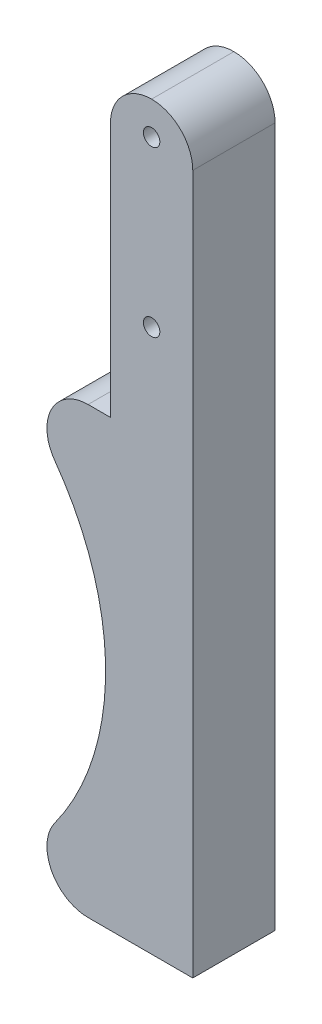
ISO-10303-21;
HEADER;
FILE_DESCRIPTION(('STEP AP214'),'2;1');
FILE_NAME('part.step','',(''),(''),'','','');
FILE_SCHEMA(('AUTOMOTIVE_DESIGN { 1 0 10303 214 1 1 1 1 }'));
ENDSEC;
DATA;
#1=APPLICATION_CONTEXT('core data for automotive mechanical design processes');
#2=APPLICATION_PROTOCOL_DEFINITION('international standard','automotive_design',2000,#1);
#3=PRODUCT_CONTEXT('',#1,'mechanical');
#4=PRODUCT('Part','Part','',(#3));
#5=PRODUCT_RELATED_PRODUCT_CATEGORY('part','',(#4));
#6=PRODUCT_DEFINITION_FORMATION('','',#4);
#7=PRODUCT_DEFINITION_CONTEXT('part definition',#1,'design');
#8=PRODUCT_DEFINITION('design','',#6,#7);
#9=PRODUCT_DEFINITION_SHAPE('','',#8);
#10=(LENGTH_UNIT() NAMED_UNIT(*) SI_UNIT(.MILLI.,.METRE.));
#11=(NAMED_UNIT(*) PLANE_ANGLE_UNIT() SI_UNIT($,.RADIAN.));
#12=(NAMED_UNIT(*) SI_UNIT($,.STERADIAN.) SOLID_ANGLE_UNIT());
#13=UNCERTAINTY_MEASURE_WITH_UNIT(LENGTH_MEASURE(1.E-05),#10,'distance_accuracy_value','');
#14=(GEOMETRIC_REPRESENTATION_CONTEXT(3) GLOBAL_UNCERTAINTY_ASSIGNED_CONTEXT((#13)) GLOBAL_UNIT_ASSIGNED_CONTEXT((#10,
#11,#12)) REPRESENTATION_CONTEXT('',''));
#15=CARTESIAN_POINT('',(0.,0.,0.));
#16=DIRECTION('',(0.,0.,1.));
#17=DIRECTION('',(1.,0.,0.));
#18=AXIS2_PLACEMENT_3D('',#15,#16,#17);
#19=CARTESIAN_POINT('',(0.,0.,10.));
#20=DIRECTION('',(1.,0.,0.));
#21=DIRECTION('',(0.,0.,-1.));
#22=AXIS2_PLACEMENT_3D('',#19,#20,#21);
#23=PLANE('',#22);
#24=DIRECTION('',(0.,-1.,0.));
#25=VECTOR('',#24,1.);
#26=CARTESIAN_POINT('',(0.,0.,0.));
#27=LINE('',#26,#25);
#28=CARTESIAN_POINT('',(0.,85.,0.));
#29=VERTEX_POINT('',#28);
#30=CARTESIAN_POINT('',(0.,54.,0.));
#31=VERTEX_POINT('',#30);
#32=EDGE_CURVE('E129',#29,#31,#27,.T.);
#33=ORIENTED_EDGE('',*,*,#32,.T.);
#34=DIRECTION('',(0.,0.,1.));
#35=VECTOR('',#34,1.);
#36=CARTESIAN_POINT('',(0.,54.,0.));
#37=LINE('',#36,#35);
#38=CARTESIAN_POINT('',(0.,54.,10.));
#39=VERTEX_POINT('',#38);
#40=EDGE_CURVE('E150',#31,#39,#37,.T.);
#41=ORIENTED_EDGE('',*,*,#40,.T.);
#42=DIRECTION('',(0.,-1.,0.));
#43=VECTOR('',#42,1.);
#44=CARTESIAN_POINT('',(0.,0.,10.));
#45=LINE('',#44,#43);
#46=CARTESIAN_POINT('',(0.,85.,10.));
#47=VERTEX_POINT('',#46);
#48=EDGE_CURVE('E111',#47,#39,#45,.T.);
#49=ORIENTED_EDGE('',*,*,#48,.F.);
#50=DIRECTION('',(0.,0.,-1.));
#51=VECTOR('',#50,1.);
#52=CARTESIAN_POINT('',(0.,85.,10.));
#53=LINE('',#52,#51);
#54=EDGE_CURVE('E143',#47,#29,#53,.T.);
#55=ORIENTED_EDGE('',*,*,#54,.T.);
#56=EDGE_LOOP('',(#33,#41,#49,#55));
#57=FACE_BOUND('',#56,.T.);
#58=ADVANCED_FACE('F33',(#57),#23,.F.);
#59=CARTESIAN_POINT('',(0.,0.,10.));
#60=DIRECTION('',(0.,1.,0.));
#61=DIRECTION('',(0.,0.,1.));
#62=AXIS2_PLACEMENT_3D('',#59,#60,#61);
#63=PLANE('',#62);
#64=DIRECTION('',(1.,0.,0.));
#65=VECTOR('',#64,1.);
#66=CARTESIAN_POINT('',(0.,0.,10.));
#67=LINE('',#66,#65);
#68=CARTESIAN_POINT('',(-2.72148323700511,0.,10.));
#69=VERTEX_POINT('',#68);
#70=CARTESIAN_POINT('',(10.,0.,10.));
#71=VERTEX_POINT('',#70);
#72=EDGE_CURVE('E103',#69,#71,#67,.T.);
#73=ORIENTED_EDGE('',*,*,#72,.F.);
#74=DIRECTION('',(0.,0.,-1.));
#75=VECTOR('',#74,1.);
#76=CARTESIAN_POINT('',(-2.72148323700511,0.,0.));
#77=LINE('',#76,#75);
#78=CARTESIAN_POINT('',(-2.72148323700511,0.,0.));
#79=VERTEX_POINT('',#78);
#80=EDGE_CURVE('E11',#69,#79,#77,.T.);
#81=ORIENTED_EDGE('',*,*,#80,.T.);
#82=DIRECTION('',(1.,0.,0.));
#83=VECTOR('',#82,1.);
#84=CARTESIAN_POINT('',(0.,0.,0.));
#85=LINE('',#84,#83);
#86=CARTESIAN_POINT('',(10.,0.,0.));
#87=VERTEX_POINT('',#86);
#88=EDGE_CURVE('E116',#79,#87,#85,.T.);
#89=ORIENTED_EDGE('',*,*,#88,.T.);
#90=DIRECTION('',(0.,0.,-1.));
#91=VECTOR('',#90,1.);
#92=CARTESIAN_POINT('',(10.,0.,10.));
#93=LINE('',#92,#91);
#94=EDGE_CURVE('E114',#71,#87,#93,.T.);
#95=ORIENTED_EDGE('',*,*,#94,.F.);
#96=EDGE_LOOP('',(#73,#81,#89,#95));
#97=FACE_BOUND('',#96,.T.);
#98=ADVANCED_FACE('F115',(#97),#63,.F.);
#99=CARTESIAN_POINT('',(10.,0.,10.));
#100=DIRECTION('',(-1.,0.,0.));
#101=DIRECTION('',(0.,0.,1.));
#102=AXIS2_PLACEMENT_3D('',#99,#100,#101);
#103=PLANE('',#102);
#104=DIRECTION('',(0.,1.,0.));
#105=VECTOR('',#104,1.);
#106=CARTESIAN_POINT('',(10.,0.,0.));
#107=LINE('',#106,#105);
#108=CARTESIAN_POINT('',(10.,85.,0.));
#109=VERTEX_POINT('',#108);
#110=EDGE_CURVE('E133',#87,#109,#107,.T.);
#111=ORIENTED_EDGE('',*,*,#110,.T.);
#112=DIRECTION('',(0.,0.,-1.));
#113=VECTOR('',#112,1.);
#114=CARTESIAN_POINT('',(10.,85.,10.));
#115=LINE('',#114,#113);
#116=CARTESIAN_POINT('',(10.,85.,10.));
#117=VERTEX_POINT('',#116);
#118=EDGE_CURVE('E125',#109,#117,#115,.F.);
#119=ORIENTED_EDGE('',*,*,#118,.T.);
#120=DIRECTION('',(0.,1.,0.));
#121=VECTOR('',#120,1.);
#122=CARTESIAN_POINT('',(10.,0.,10.));
#123=LINE('',#122,#121);
#124=EDGE_CURVE('E108',#71,#117,#123,.T.);
#125=ORIENTED_EDGE('',*,*,#124,.F.);
#126=ORIENTED_EDGE('',*,*,#94,.T.);
#127=EDGE_LOOP('',(#111,#119,#125,#126));
#128=FACE_BOUND('',#127,.T.);
#129=ADVANCED_FACE('F123',(#128),#103,.F.);
#130=CARTESIAN_POINT('',(0.,0.,10.));
#131=DIRECTION('',(0.,0.,-1.));
#132=DIRECTION('',(-1.,0.,0.));
#133=AXIS2_PLACEMENT_3D('',#130,#131,#132);
#134=PLANE('',#133);
#135=CARTESIAN_POINT('',(5.,86.,10.));
#136=DIRECTION('',(0.,0.,1.));
#137=DIRECTION('',(1.,0.,0.));
#138=AXIS2_PLACEMENT_3D('',#135,#136,#137);
#139=CIRCLE('',#138,1.);
#140=CARTESIAN_POINT('',(6.,86.,10.));
#141=VERTEX_POINT('',#140);
#142=EDGE_CURVE('E149',#141,#141,#139,.T.);
#143=ORIENTED_EDGE('',*,*,#142,.F.);
#144=EDGE_LOOP('',(#143));
#145=FACE_BOUND('',#144,.T.);
#146=CARTESIAN_POINT('',(5.,66.,10.));
#147=DIRECTION('',(0.,0.,1.));
#148=DIRECTION('',(1.,0.,0.));
#149=AXIS2_PLACEMENT_3D('',#146,#147,#148);
#150=CIRCLE('',#149,1.);
#151=CARTESIAN_POINT('',(6.,66.,10.));
#152=VERTEX_POINT('',#151);
#153=EDGE_CURVE('E192',#152,#152,#150,.T.);
#154=ORIENTED_EDGE('',*,*,#153,.F.);
#155=EDGE_LOOP('',(#154));
#156=FACE_BOUND('',#155,.T.);
#157=DIRECTION('',(-1.,0.,0.));
#158=VECTOR('',#157,1.);
#159=CARTESIAN_POINT('',(0.,54.,10.));
#160=LINE('',#159,#158);
#161=CARTESIAN_POINT('',(-2.72148323700512,54.,10.));
#162=VERTEX_POINT('',#161);
#163=EDGE_CURVE('E180',#39,#162,#160,.T.);
#164=ORIENTED_EDGE('',*,*,#163,.T.);
#165=CARTESIAN_POINT('',(-2.72148323700511,49.,10.));
#166=DIRECTION('',(0.,0.,-1.));
#167=DIRECTION('',(-1.,0.,0.));
#168=AXIS2_PLACEMENT_3D('',#165,#166,#167);
#169=CIRCLE('',#168,5.);
#170=CARTESIAN_POINT('',(-6.77062580742117,46.0666666666667,10.));
#171=VERTEX_POINT('',#170);
#172=EDGE_CURVE('E154',#162,#171,#169,.F.);
#173=ORIENTED_EDGE('',*,*,#172,.T.);
#174=CARTESIAN_POINT('',(-33.0900525151255,27.,10.));
#175=DIRECTION('',(0.,0.,-1.));
#176=DIRECTION('',(-1.,0.,0.));
#177=AXIS2_PLACEMENT_3D('',#174,#175,#176);
#178=CIRCLE('',#177,32.5);
#179=CARTESIAN_POINT('',(-6.77062580742117,7.93333333333333,10.));
#180=VERTEX_POINT('',#179);
#181=EDGE_CURVE('E175',#171,#180,#178,.T.);
#182=ORIENTED_EDGE('',*,*,#181,.T.);
#183=CARTESIAN_POINT('',(-2.72148323700511,5.,10.));
#184=DIRECTION('',(0.,0.,-1.));
#185=DIRECTION('',(-1.,0.,0.));
#186=AXIS2_PLACEMENT_3D('',#183,#184,#185);
#187=CIRCLE('',#186,5.);
#188=EDGE_CURVE('E110',#180,#69,#187,.F.);
#189=ORIENTED_EDGE('',*,*,#188,.T.);
#190=ORIENTED_EDGE('',*,*,#72,.T.);
#191=ORIENTED_EDGE('',*,*,#124,.T.);
#192=CARTESIAN_POINT('',(5.,85.,10.));
#193=DIRECTION('',(0.,0.,-1.));
#194=DIRECTION('',(-1.,0.,0.));
#195=AXIS2_PLACEMENT_3D('',#192,#193,#194);
#196=CIRCLE('',#195,5.);
#197=CARTESIAN_POINT('',(5.,90.,10.));
#198=VERTEX_POINT('',#197);
#199=EDGE_CURVE('E141',#117,#198,#196,.F.);
#200=ORIENTED_EDGE('',*,*,#199,.T.);
#201=CARTESIAN_POINT('',(5.,85.,10.));
#202=DIRECTION('',(0.,0.,-1.));
#203=DIRECTION('',(-1.,0.,0.));
#204=AXIS2_PLACEMENT_3D('',#201,#202,#203);
#205=CIRCLE('',#204,5.);
#206=EDGE_CURVE('E139',#198,#47,#205,.F.);
#207=ORIENTED_EDGE('',*,*,#206,.T.);
#208=ORIENTED_EDGE('',*,*,#48,.T.);
#209=EDGE_LOOP('',(#164,#173,#182,#189,#190,#191,#200,#207,#208));
#210=FACE_BOUND('',#209,.T.);
#211=ADVANCED_FACE('F106',(#145,#156,#210),#134,.F.);
#212=CARTESIAN_POINT('',(0.,0.,0.));
#213=DIRECTION('',(0.,0.,-1.));
#214=DIRECTION('',(-1.,0.,0.));
#215=AXIS2_PLACEMENT_3D('',#212,#213,#214);
#216=PLANE('',#215);
#217=CARTESIAN_POINT('',(5.,86.,0.));
#218=DIRECTION('',(0.,0.,1.));
#219=DIRECTION('',(1.,0.,0.));
#220=AXIS2_PLACEMENT_3D('',#217,#218,#219);
#221=CIRCLE('',#220,1.);
#222=CARTESIAN_POINT('',(6.,86.,0.));
#223=VERTEX_POINT('',#222);
#224=EDGE_CURVE('E189',#223,#223,#221,.T.);
#225=ORIENTED_EDGE('',*,*,#224,.T.);
#226=EDGE_LOOP('',(#225));
#227=FACE_BOUND('',#226,.T.);
#228=CARTESIAN_POINT('',(5.,66.,0.));
#229=DIRECTION('',(0.,0.,1.));
#230=DIRECTION('',(1.,0.,0.));
#231=AXIS2_PLACEMENT_3D('',#228,#229,#230);
#232=CIRCLE('',#231,1.);
#233=CARTESIAN_POINT('',(6.,66.,0.));
#234=VERTEX_POINT('',#233);
#235=EDGE_CURVE('E131',#234,#234,#232,.T.);
#236=ORIENTED_EDGE('',*,*,#235,.T.);
#237=EDGE_LOOP('',(#236));
#238=FACE_BOUND('',#237,.T.);
#239=CARTESIAN_POINT('',(-33.0900525151255,27.,0.));
#240=DIRECTION('',(0.,0.,-1.));
#241=DIRECTION('',(-1.,0.,0.));
#242=AXIS2_PLACEMENT_3D('',#239,#240,#241);
#243=CIRCLE('',#242,32.5);
#244=CARTESIAN_POINT('',(-6.77062580742117,46.0666666666667,0.));
#245=VERTEX_POINT('',#244);
#246=CARTESIAN_POINT('',(-6.77062580742117,7.93333333333333,0.));
#247=VERTEX_POINT('',#246);
#248=EDGE_CURVE('E167',#245,#247,#243,.T.);
#249=ORIENTED_EDGE('',*,*,#248,.F.);
#250=CARTESIAN_POINT('',(-2.72148323700511,49.,0.));
#251=DIRECTION('',(0.,0.,-1.));
#252=DIRECTION('',(-1.,0.,0.));
#253=AXIS2_PLACEMENT_3D('',#250,#251,#252);
#254=CIRCLE('',#253,5.);
#255=CARTESIAN_POINT('',(-2.72148323700512,54.,0.));
#256=VERTEX_POINT('',#255);
#257=EDGE_CURVE('E41',#245,#256,#254,.T.);
#258=ORIENTED_EDGE('',*,*,#257,.T.);
#259=DIRECTION('',(-1.,0.,0.));
#260=VECTOR('',#259,1.);
#261=CARTESIAN_POINT('',(0.,54.,0.));
#262=LINE('',#261,#260);
#263=EDGE_CURVE('E166',#31,#256,#262,.T.);
#264=ORIENTED_EDGE('',*,*,#263,.F.);
#265=ORIENTED_EDGE('',*,*,#32,.F.);
#266=CARTESIAN_POINT('',(5.,85.,0.));
#267=DIRECTION('',(0.,0.,-1.));
#268=DIRECTION('',(-1.,0.,0.));
#269=AXIS2_PLACEMENT_3D('',#266,#267,#268);
#270=CIRCLE('',#269,5.);
#271=CARTESIAN_POINT('',(5.,90.,0.));
#272=VERTEX_POINT('',#271);
#273=EDGE_CURVE('E120',#29,#272,#270,.T.);
#274=ORIENTED_EDGE('',*,*,#273,.T.);
#275=CARTESIAN_POINT('',(5.,85.,0.));
#276=DIRECTION('',(0.,0.,-1.));
#277=DIRECTION('',(-1.,0.,0.));
#278=AXIS2_PLACEMENT_3D('',#275,#276,#277);
#279=CIRCLE('',#278,5.);
#280=EDGE_CURVE('E136',#272,#109,#279,.T.);
#281=ORIENTED_EDGE('',*,*,#280,.T.);
#282=ORIENTED_EDGE('',*,*,#110,.F.);
#283=ORIENTED_EDGE('',*,*,#88,.F.);
#284=CARTESIAN_POINT('',(-2.72148323700511,5.,0.));
#285=DIRECTION('',(0.,0.,-1.));
#286=DIRECTION('',(-1.,0.,0.));
#287=AXIS2_PLACEMENT_3D('',#284,#285,#286);
#288=CIRCLE('',#287,5.);
#289=EDGE_CURVE('E53',#79,#247,#288,.T.);
#290=ORIENTED_EDGE('',*,*,#289,.T.);
#291=EDGE_LOOP('',(#249,#258,#264,#265,#274,#281,#282,#283,#290));
#292=FACE_BOUND('',#291,.T.);
#293=ADVANCED_FACE('F164',(#227,#238,#292),#216,.T.);
#294=CARTESIAN_POINT('',(5.,66.,0.));
#295=DIRECTION('',(0.,0.,1.));
#296=DIRECTION('',(1.,0.,0.));
#297=AXIS2_PLACEMENT_3D('',#294,#295,#296);
#298=CYLINDRICAL_SURFACE('',#297,1.);
#299=ORIENTED_EDGE('',*,*,#235,.F.);
#300=EDGE_LOOP('',(#299));
#301=FACE_BOUND('',#300,.T.);
#302=ORIENTED_EDGE('',*,*,#153,.T.);
#303=EDGE_LOOP('',(#302));
#304=FACE_BOUND('',#303,.T.);
#305=ADVANCED_FACE('F229',(#301,#304),#298,.F.);
#306=CARTESIAN_POINT('',(5.,86.,0.));
#307=DIRECTION('',(0.,0.,1.));
#308=DIRECTION('',(1.,0.,0.));
#309=AXIS2_PLACEMENT_3D('',#306,#307,#308);
#310=CYLINDRICAL_SURFACE('',#309,1.);
#311=ORIENTED_EDGE('',*,*,#224,.F.);
#312=EDGE_LOOP('',(#311));
#313=FACE_BOUND('',#312,.T.);
#314=ORIENTED_EDGE('',*,*,#142,.T.);
#315=EDGE_LOOP('',(#314));
#316=FACE_BOUND('',#315,.T.);
#317=ADVANCED_FACE('F216',(#313,#316),#310,.F.);
#318=CARTESIAN_POINT('',(5.,85.,10.));
#319=DIRECTION('',(0.,0.,-1.));
#320=DIRECTION('',(-1.,0.,0.));
#321=AXIS2_PLACEMENT_3D('',#318,#319,#320);
#322=CYLINDRICAL_SURFACE('',#321,5.);
#323=ORIENTED_EDGE('',*,*,#54,.F.);
#324=ORIENTED_EDGE('',*,*,#206,.F.);
#325=DIRECTION('',(0.,0.,-1.));
#326=VECTOR('',#325,1.);
#327=CARTESIAN_POINT('',(5.,90.,10.));
#328=LINE('',#327,#326);
#329=EDGE_CURVE('E146',#272,#198,#328,.F.);
#330=ORIENTED_EDGE('',*,*,#329,.F.);
#331=ORIENTED_EDGE('',*,*,#273,.F.);
#332=EDGE_LOOP('',(#323,#324,#330,#331));
#333=FACE_BOUND('',#332,.T.);
#334=ADVANCED_FACE('F204',(#333),#322,.T.);
#335=CARTESIAN_POINT('',(5.,85.,10.));
#336=DIRECTION('',(0.,0.,-1.));
#337=DIRECTION('',(-1.,0.,0.));
#338=AXIS2_PLACEMENT_3D('',#335,#336,#337);
#339=CYLINDRICAL_SURFACE('',#338,5.);
#340=ORIENTED_EDGE('',*,*,#199,.F.);
#341=ORIENTED_EDGE('',*,*,#118,.F.);
#342=ORIENTED_EDGE('',*,*,#280,.F.);
#343=ORIENTED_EDGE('',*,*,#329,.T.);
#344=EDGE_LOOP('',(#340,#341,#342,#343));
#345=FACE_BOUND('',#344,.T.);
#346=ADVANCED_FACE('F208',(#345),#339,.T.);
#347=CARTESIAN_POINT('',(-33.0900525151255,27.,0.));
#348=DIRECTION('',(0.,0.,1.));
#349=DIRECTION('',(1.,0.,0.));
#350=AXIS2_PLACEMENT_3D('',#347,#348,#349);
#351=CYLINDRICAL_SURFACE('',#350,32.5);
#352=ORIENTED_EDGE('',*,*,#181,.F.);
#353=DIRECTION('',(0.,0.,1.));
#354=VECTOR('',#353,1.);
#355=CARTESIAN_POINT('',(-6.77062580742117,46.0666666666667,0.));
#356=LINE('',#355,#354);
#357=EDGE_CURVE('E159',#171,#245,#356,.F.);
#358=ORIENTED_EDGE('',*,*,#357,.T.);
#359=ORIENTED_EDGE('',*,*,#248,.T.);
#360=DIRECTION('',(0.,0.,1.));
#361=VECTOR('',#360,1.);
#362=CARTESIAN_POINT('',(-6.77062580742117,7.93333333333333,0.));
#363=LINE('',#362,#361);
#364=EDGE_CURVE('E156',#247,#180,#363,.T.);
#365=ORIENTED_EDGE('',*,*,#364,.T.);
#366=EDGE_LOOP('',(#352,#358,#359,#365));
#367=FACE_BOUND('',#366,.T.);
#368=ADVANCED_FACE('F182',(#367),#351,.F.);
#369=CARTESIAN_POINT('',(0.,54.,0.));
#370=DIRECTION('',(0.,1.,0.));
#371=DIRECTION('',(-1.,0.,0.));
#372=AXIS2_PLACEMENT_3D('',#369,#370,#371);
#373=PLANE('',#372);
#374=ORIENTED_EDGE('',*,*,#263,.T.);
#375=DIRECTION('',(0.,0.,1.));
#376=VECTOR('',#375,1.);
#377=CARTESIAN_POINT('',(-2.72148323700512,54.,0.));
#378=LINE('',#377,#376);
#379=EDGE_CURVE('E145',#256,#162,#378,.T.);
#380=ORIENTED_EDGE('',*,*,#379,.T.);
#381=ORIENTED_EDGE('',*,*,#163,.F.);
#382=ORIENTED_EDGE('',*,*,#40,.F.);
#383=EDGE_LOOP('',(#374,#380,#381,#382));
#384=FACE_BOUND('',#383,.T.);
#385=ADVANCED_FACE('F173',(#384),#373,.T.);
#386=CARTESIAN_POINT('',(-2.72148323700511,49.,0.));
#387=DIRECTION('',(0.,0.,1.));
#388=DIRECTION('',(1.,0.,0.));
#389=AXIS2_PLACEMENT_3D('',#386,#387,#388);
#390=CYLINDRICAL_SURFACE('',#389,5.);
#391=ORIENTED_EDGE('',*,*,#257,.F.);
#392=ORIENTED_EDGE('',*,*,#357,.F.);
#393=ORIENTED_EDGE('',*,*,#172,.F.);
#394=ORIENTED_EDGE('',*,*,#379,.F.);
#395=EDGE_LOOP('',(#391,#392,#393,#394));
#396=FACE_BOUND('',#395,.T.);
#397=ADVANCED_FACE('F177',(#396),#390,.T.);
#398=CARTESIAN_POINT('',(-2.72148323700511,5.,0.));
#399=DIRECTION('',(0.,0.,1.));
#400=DIRECTION('',(1.,0.,0.));
#401=AXIS2_PLACEMENT_3D('',#398,#399,#400);
#402=CYLINDRICAL_SURFACE('',#401,5.);
#403=ORIENTED_EDGE('',*,*,#289,.F.);
#404=ORIENTED_EDGE('',*,*,#80,.F.);
#405=ORIENTED_EDGE('',*,*,#188,.F.);
#406=ORIENTED_EDGE('',*,*,#364,.F.);
#407=EDGE_LOOP('',(#403,#404,#405,#406));
#408=FACE_BOUND('',#407,.T.);
#409=ADVANCED_FACE('F35',(#408),#402,.T.);
#410=CLOSED_SHELL('',(#58,#98,#129,#211,#293,#305,#317,#334,#346,#368,#385,#397,#409));
#411=MANIFOLD_SOLID_BREP('B2',#410);
#412=ADVANCED_BREP_SHAPE_REPRESENTATION('',(#18,#411),#14);
#413=SHAPE_DEFINITION_REPRESENTATION(#9,#412);
ENDSEC;
END-ISO-10303-21;
